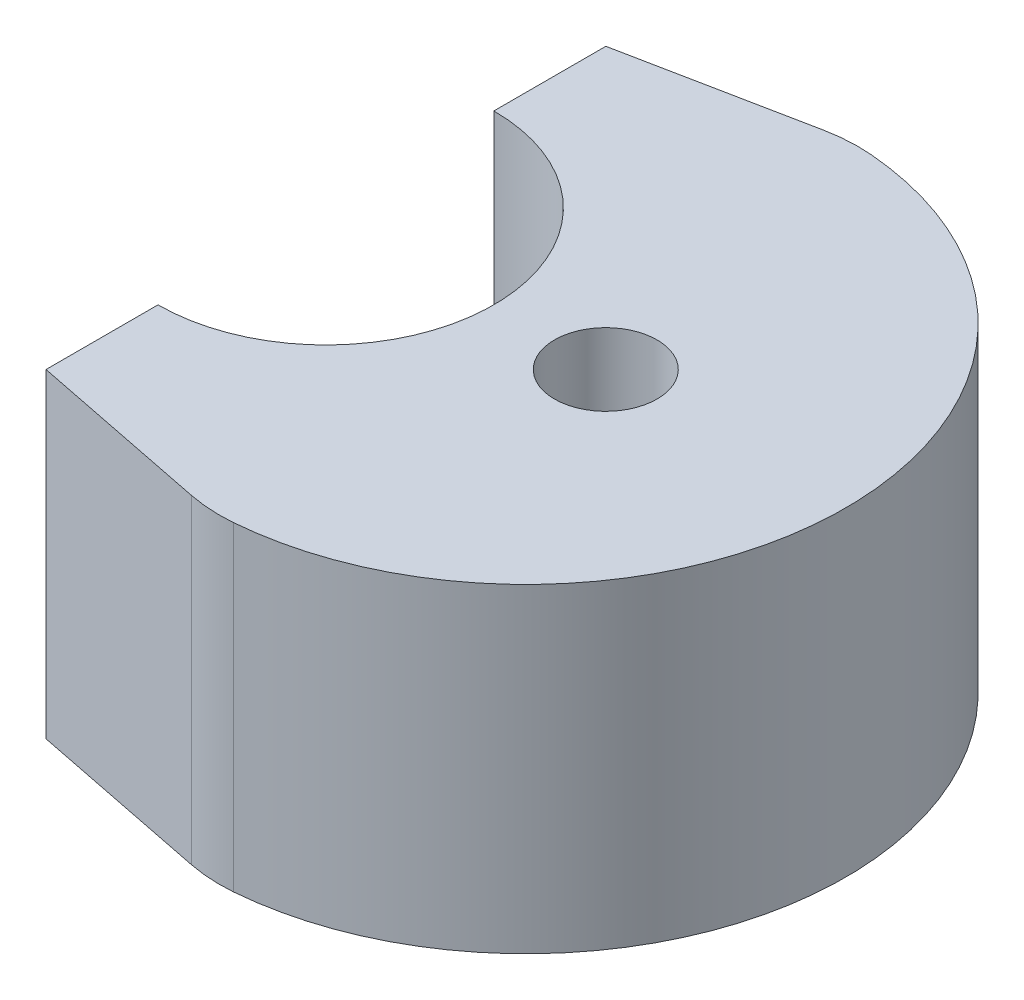
ISO-10303-21;
HEADER;
FILE_DESCRIPTION(('STEP AP214'),'2;1');
FILE_NAME('part.step','',(''),(''),'','','');
FILE_SCHEMA(('AUTOMOTIVE_DESIGN { 1 0 10303 214 1 1 1 1 }'));
ENDSEC;
DATA;
#1=APPLICATION_CONTEXT('core data for automotive mechanical design processes');
#2=APPLICATION_PROTOCOL_DEFINITION('international standard','automotive_design',2000,#1);
#3=PRODUCT_CONTEXT('',#1,'mechanical');
#4=PRODUCT('Part','Part','',(#3));
#5=PRODUCT_RELATED_PRODUCT_CATEGORY('part','',(#4));
#6=PRODUCT_DEFINITION_FORMATION('','',#4);
#7=PRODUCT_DEFINITION_CONTEXT('part definition',#1,'design');
#8=PRODUCT_DEFINITION('design','',#6,#7);
#9=PRODUCT_DEFINITION_SHAPE('','',#8);
#10=(LENGTH_UNIT() NAMED_UNIT(*) SI_UNIT(.MILLI.,.METRE.));
#11=(NAMED_UNIT(*) PLANE_ANGLE_UNIT() SI_UNIT($,.RADIAN.));
#12=(NAMED_UNIT(*) SI_UNIT($,.STERADIAN.) SOLID_ANGLE_UNIT());
#13=UNCERTAINTY_MEASURE_WITH_UNIT(LENGTH_MEASURE(1.E-05),#10,'distance_accuracy_value','');
#14=(GEOMETRIC_REPRESENTATION_CONTEXT(3) GLOBAL_UNCERTAINTY_ASSIGNED_CONTEXT((#13)) GLOBAL_UNIT_ASSIGNED_CONTEXT((#10,
#11,#12)) REPRESENTATION_CONTEXT('',''));
#15=CARTESIAN_POINT('',(0.,0.,0.));
#16=DIRECTION('',(0.,0.,1.));
#17=DIRECTION('',(1.,0.,0.));
#18=AXIS2_PLACEMENT_3D('',#15,#16,#17);
#19=CARTESIAN_POINT('',(0.,0.5,0.));
#20=DIRECTION('',(0.,-1.,0.));
#21=DIRECTION('',(0.,0.,-1.));
#22=AXIS2_PLACEMENT_3D('',#19,#20,#21);
#23=CYLINDRICAL_SURFACE('',#22,2.);
#24=CARTESIAN_POINT('',(0.,0.,0.));
#25=DIRECTION('',(0.,1.,0.));
#26=DIRECTION('',(0.,0.,1.));
#27=AXIS2_PLACEMENT_3D('',#24,#25,#26);
#28=CIRCLE('',#27,2.);
#29=CARTESIAN_POINT('',(0.164100898177524,0.,-1.99325635461607));
#30=VERTEX_POINT('',#29);
#31=CARTESIAN_POINT('',(0.164100898177525,0.,1.99325635461607));
#32=VERTEX_POINT('',#31);
#33=EDGE_CURVE('E103',#30,#32,#28,.F.);
#34=ORIENTED_EDGE('',*,*,#33,.F.);
#35=DIRECTION('',(0.,-1.,0.));
#36=VECTOR('',#35,1.);
#37=CARTESIAN_POINT('',(0.164100898177524,0.5,-1.99325635461607));
#38=LINE('',#37,#36);
#39=CARTESIAN_POINT('',(0.164100898177524,2.,-1.99325635461607));
#40=VERTEX_POINT('',#39);
#41=EDGE_CURVE('E11',#40,#30,#38,.T.);
#42=ORIENTED_EDGE('',*,*,#41,.F.);
#43=CARTESIAN_POINT('',(0.,2.,0.));
#44=DIRECTION('',(0.,1.,0.));
#45=DIRECTION('',(0.,0.,1.));
#46=AXIS2_PLACEMENT_3D('',#43,#44,#45);
#47=CIRCLE('',#46,2.);
#48=CARTESIAN_POINT('',(0.164100898177525,2.,1.99325635461607));
#49=VERTEX_POINT('',#48);
#50=EDGE_CURVE('E174',#40,#49,#47,.F.);
#51=ORIENTED_EDGE('',*,*,#50,.T.);
#52=DIRECTION('',(0.,-1.,0.));
#53=VECTOR('',#52,1.);
#54=CARTESIAN_POINT('',(0.164100898177525,0.5,1.99325635461607));
#55=LINE('',#54,#53);
#56=EDGE_CURVE('E94',#49,#32,#55,.T.);
#57=ORIENTED_EDGE('',*,*,#56,.T.);
#58=EDGE_LOOP('',(#34,#42,#51,#57));
#59=FACE_BOUND('',#58,.T.);
#60=ADVANCED_FACE('F33',(#59),#23,.T.);
#61=CARTESIAN_POINT('',(0.0820504490887622,0.5,-0.996628177308034));
#62=DIRECTION('',(0.,-1.,0.));
#63=DIRECTION('',(0.,0.,-1.));
#64=AXIS2_PLACEMENT_3D('',#61,#62,#63);
#65=CYLINDRICAL_SURFACE('',#64,1.);
#66=CARTESIAN_POINT('',(0.0820504490887622,0.,-0.996628177308034));
#67=DIRECTION('',(0.,1.,0.));
#68=DIRECTION('',(0.,0.,1.));
#69=AXIS2_PLACEMENT_3D('',#66,#67,#68);
#70=CIRCLE('',#69,1.);
#71=CARTESIAN_POINT('',(-0.113883759971435,0.,-1.97724522066388));
#72=VERTEX_POINT('',#71);
#73=EDGE_CURVE('E139',#30,#72,#70,.T.);
#74=ORIENTED_EDGE('',*,*,#73,.T.);
#75=DIRECTION('',(0.,-1.,0.));
#76=VECTOR('',#75,1.);
#77=CARTESIAN_POINT('',(-0.113883759971435,0.5,-1.97724522066388));
#78=LINE('',#77,#76);
#79=CARTESIAN_POINT('',(-0.113883759971435,2.,-1.97724522066388));
#80=VERTEX_POINT('',#79);
#81=EDGE_CURVE('E43',#80,#72,#78,.T.);
#82=ORIENTED_EDGE('',*,*,#81,.F.);
#83=CARTESIAN_POINT('',(0.0820504490887622,2.,-0.996628177308034));
#84=DIRECTION('',(0.,1.,0.));
#85=DIRECTION('',(0.,0.,1.));
#86=AXIS2_PLACEMENT_3D('',#83,#84,#85);
#87=CIRCLE('',#86,1.);
#88=EDGE_CURVE('E184',#40,#80,#87,.T.);
#89=ORIENTED_EDGE('',*,*,#88,.F.);
#90=ORIENTED_EDGE('',*,*,#41,.T.);
#91=EDGE_LOOP('',(#74,#82,#89,#90));
#92=FACE_BOUND('',#91,.T.);
#93=ADVANCED_FACE('F233',(#92),#65,.T.);
#94=CARTESIAN_POINT('',(-0.384272849561752,0.5,-1.92321957143991));
#95=DIRECTION('',(0.195934209060197,0.,0.980617043355843));
#96=DIRECTION('',(0.980617043355843,0.,-0.195934209060197));
#97=AXIS2_PLACEMENT_3D('',#94,#95,#96);
#98=PLANE('',#97);
#99=DIRECTION('',(-0.980617043355843,0.,0.195934209060197));
#100=VECTOR('',#99,1.);
#101=CARTESIAN_POINT('',(-0.384272849561752,0.,-1.92321957143991));
#102=LINE('',#101,#100);
#103=CARTESIAN_POINT('',(-1.24999999999968,0.,-1.7502411741825));
#104=VERTEX_POINT('',#103);
#105=EDGE_CURVE('E142',#72,#104,#102,.T.);
#106=ORIENTED_EDGE('',*,*,#105,.T.);
#107=DIRECTION('',(0.,-1.,0.));
#108=VECTOR('',#107,1.);
#109=CARTESIAN_POINT('',(-1.24999999999968,0.5,-1.7502411741825));
#110=LINE('',#109,#108);
#111=CARTESIAN_POINT('',(-1.24999999999968,2.,-1.7502411741825));
#112=VERTEX_POINT('',#111);
#113=EDGE_CURVE('E118',#112,#104,#110,.T.);
#114=ORIENTED_EDGE('',*,*,#113,.F.);
#115=DIRECTION('',(-0.980617043355843,0.,0.195934209060197));
#116=VECTOR('',#115,1.);
#117=CARTESIAN_POINT('',(-0.384272849561752,2.,-1.92321957143991));
#118=LINE('',#117,#116);
#119=EDGE_CURVE('E191',#80,#112,#118,.T.);
#120=ORIENTED_EDGE('',*,*,#119,.F.);
#121=ORIENTED_EDGE('',*,*,#81,.T.);
#122=EDGE_LOOP('',(#106,#114,#120,#121));
#123=FACE_BOUND('',#122,.T.);
#124=ADVANCED_FACE('F164',(#123),#98,.F.);
#125=CARTESIAN_POINT('',(-1.24999999999968,0.5,0.));
#126=DIRECTION('',(-1.,0.,0.));
#127=DIRECTION('',(0.,0.,1.));
#128=AXIS2_PLACEMENT_3D('',#125,#126,#127);
#129=PLANE('',#128);
#130=DIRECTION('',(0.,0.,-1.));
#131=VECTOR('',#130,1.);
#132=CARTESIAN_POINT('',(-1.24999999999968,0.,0.));
#133=LINE('',#132,#131);
#134=CARTESIAN_POINT('',(-1.24999999999968,0.,-1.2499999999997));
#135=VERTEX_POINT('',#134);
#136=EDGE_CURVE('E145',#135,#104,#133,.T.);
#137=ORIENTED_EDGE('',*,*,#136,.F.);
#138=DIRECTION('',(0.,-1.,0.));
#139=VECTOR('',#138,1.);
#140=CARTESIAN_POINT('',(-1.24999999999968,0.5,-1.2499999999997));
#141=LINE('',#140,#139);
#142=CARTESIAN_POINT('',(-1.24999999999968,0.5,-1.2499999999997));
#143=VERTEX_POINT('',#142);
#144=EDGE_CURVE('E120',#143,#135,#141,.T.);
#145=ORIENTED_EDGE('',*,*,#144,.F.);
#146=DIRECTION('',(0.,0.,1.));
#147=VECTOR('',#146,1.);
#148=CARTESIAN_POINT('',(-1.24999999999968,0.5,0.));
#149=LINE('',#148,#147);
#150=CARTESIAN_POINT('',(-1.24999999999968,0.5,-1.0499999999997));
#151=VERTEX_POINT('',#150);
#152=EDGE_CURVE('E51',#143,#151,#149,.T.);
#153=ORIENTED_EDGE('',*,*,#152,.T.);
#154=DIRECTION('',(0.,-1.,0.));
#155=VECTOR('',#154,1.);
#156=CARTESIAN_POINT('',(-1.24999999999968,2.,-1.0499999999997));
#157=LINE('',#156,#155);
#158=CARTESIAN_POINT('',(-1.24999999999968,2.,-1.0499999999997));
#159=VERTEX_POINT('',#158);
#160=EDGE_CURVE('E197',#159,#151,#157,.T.);
#161=ORIENTED_EDGE('',*,*,#160,.F.);
#162=DIRECTION('',(0.,0.,1.));
#163=VECTOR('',#162,1.);
#164=CARTESIAN_POINT('',(-1.24999999999968,2.,0.));
#165=LINE('',#164,#163);
#166=EDGE_CURVE('E160',#112,#159,#165,.T.);
#167=ORIENTED_EDGE('',*,*,#166,.F.);
#168=ORIENTED_EDGE('',*,*,#113,.T.);
#169=EDGE_LOOP('',(#137,#145,#153,#161,#167,#168));
#170=FACE_BOUND('',#169,.T.);
#171=ADVANCED_FACE('F154',(#170),#129,.T.);
#172=CARTESIAN_POINT('',(-1.24999999999968,0.5,0.));
#173=DIRECTION('',(0.,-1.,0.));
#174=DIRECTION('',(0.,0.,-1.));
#175=AXIS2_PLACEMENT_3D('',#172,#173,#174);
#176=CYLINDRICAL_SURFACE('',#175,1.24999999999969);
#177=CARTESIAN_POINT('',(-1.24999999999968,0.,0.));
#178=DIRECTION('',(0.,1.,0.));
#179=DIRECTION('',(0.,0.,1.));
#180=AXIS2_PLACEMENT_3D('',#177,#178,#179);
#181=CIRCLE('',#180,1.24999999999969);
#182=CARTESIAN_POINT('',(-1.24999999999968,0.,1.24999999999969));
#183=VERTEX_POINT('',#182);
#184=EDGE_CURVE('E111',#183,#135,#181,.T.);
#185=ORIENTED_EDGE('',*,*,#184,.F.);
#186=DIRECTION('',(0.,-1.,0.));
#187=VECTOR('',#186,1.);
#188=CARTESIAN_POINT('',(-1.24999999999968,0.5,1.24999999999969));
#189=LINE('',#188,#187);
#190=CARTESIAN_POINT('',(-1.24999999999968,0.5,1.24999999999969));
#191=VERTEX_POINT('',#190);
#192=EDGE_CURVE('E117',#191,#183,#189,.T.);
#193=ORIENTED_EDGE('',*,*,#192,.F.);
#194=CARTESIAN_POINT('',(-1.24999999999968,0.5,0.));
#195=DIRECTION('',(0.,1.,0.));
#196=DIRECTION('',(0.,0.,1.));
#197=AXIS2_PLACEMENT_3D('',#194,#195,#196);
#198=CIRCLE('',#197,1.24999999999969);
#199=EDGE_CURVE('E104',#191,#143,#198,.T.);
#200=ORIENTED_EDGE('',*,*,#199,.T.);
#201=ORIENTED_EDGE('',*,*,#144,.T.);
#202=EDGE_LOOP('',(#185,#193,#200,#201));
#203=FACE_BOUND('',#202,.T.);
#204=ADVANCED_FACE('F152',(#203),#176,.F.);
#205=CARTESIAN_POINT('',(-1.24999999999968,0.5,0.));
#206=DIRECTION('',(1.,0.,0.));
#207=DIRECTION('',(0.,0.,-1.));
#208=AXIS2_PLACEMENT_3D('',#205,#206,#207);
#209=PLANE('',#208);
#210=DIRECTION('',(0.,0.,1.));
#211=VECTOR('',#210,1.);
#212=CARTESIAN_POINT('',(-1.24999999999968,0.,0.));
#213=LINE('',#212,#211);
#214=CARTESIAN_POINT('',(-1.24999999999968,0.,1.7502411741825));
#215=VERTEX_POINT('',#214);
#216=EDGE_CURVE('E109',#183,#215,#213,.T.);
#217=ORIENTED_EDGE('',*,*,#216,.T.);
#218=DIRECTION('',(0.,-1.,0.));
#219=VECTOR('',#218,1.);
#220=CARTESIAN_POINT('',(-1.24999999999968,0.5,1.7502411741825));
#221=LINE('',#220,#219);
#222=CARTESIAN_POINT('',(-1.24999999999968,2.,1.7502411741825));
#223=VERTEX_POINT('',#222);
#224=EDGE_CURVE('E93',#223,#215,#221,.T.);
#225=ORIENTED_EDGE('',*,*,#224,.F.);
#226=DIRECTION('',(0.,0.,-1.));
#227=VECTOR('',#226,1.);
#228=CARTESIAN_POINT('',(-1.24999999999968,2.,0.));
#229=LINE('',#228,#227);
#230=CARTESIAN_POINT('',(-1.24999999999968,2.,1.04999999999969));
#231=VERTEX_POINT('',#230);
#232=EDGE_CURVE('E186',#223,#231,#229,.T.);
#233=ORIENTED_EDGE('',*,*,#232,.T.);
#234=DIRECTION('',(0.,-1.,0.));
#235=VECTOR('',#234,1.);
#236=CARTESIAN_POINT('',(-1.24999999999968,2.,1.04999999999969));
#237=LINE('',#236,#235);
#238=CARTESIAN_POINT('',(-1.24999999999968,0.5,1.04999999999969));
#239=VERTEX_POINT('',#238);
#240=EDGE_CURVE('E137',#231,#239,#237,.T.);
#241=ORIENTED_EDGE('',*,*,#240,.T.);
#242=DIRECTION('',(0.,0.,-1.));
#243=VECTOR('',#242,1.);
#244=CARTESIAN_POINT('',(-1.24999999999968,0.5,0.));
#245=LINE('',#244,#243);
#246=EDGE_CURVE('E131',#191,#239,#245,.T.);
#247=ORIENTED_EDGE('',*,*,#246,.F.);
#248=ORIENTED_EDGE('',*,*,#192,.T.);
#249=EDGE_LOOP('',(#217,#225,#233,#241,#247,#248));
#250=FACE_BOUND('',#249,.T.);
#251=ADVANCED_FACE('F222',(#250),#209,.F.);
#252=CARTESIAN_POINT('',(-0.384272849561752,0.5,1.92321957143991));
#253=DIRECTION('',(-0.195934209060197,0.,0.980617043355843));
#254=DIRECTION('',(0.980617043355843,0.,0.195934209060197));
#255=AXIS2_PLACEMENT_3D('',#252,#253,#254);
#256=PLANE('',#255);
#257=DIRECTION('',(-0.980617043355843,0.,-0.195934209060197));
#258=VECTOR('',#257,1.);
#259=CARTESIAN_POINT('',(-0.384272849561752,0.,1.92321957143991));
#260=LINE('',#259,#258);
#261=CARTESIAN_POINT('',(-0.113883759971435,0.,1.97724522066388));
#262=VERTEX_POINT('',#261);
#263=EDGE_CURVE('E100',#262,#215,#260,.T.);
#264=ORIENTED_EDGE('',*,*,#263,.F.);
#265=DIRECTION('',(0.,-1.,0.));
#266=VECTOR('',#265,1.);
#267=CARTESIAN_POINT('',(-0.113883759971435,0.5,1.97724522066388));
#268=LINE('',#267,#266);
#269=CARTESIAN_POINT('',(-0.113883759971435,2.,1.97724522066388));
#270=VERTEX_POINT('',#269);
#271=EDGE_CURVE('E80',#270,#262,#268,.T.);
#272=ORIENTED_EDGE('',*,*,#271,.F.);
#273=DIRECTION('',(-0.980617043355843,0.,-0.195934209060197));
#274=VECTOR('',#273,1.);
#275=CARTESIAN_POINT('',(-0.384272849561752,2.,1.92321957143991));
#276=LINE('',#275,#274);
#277=EDGE_CURVE('E182',#270,#223,#276,.T.);
#278=ORIENTED_EDGE('',*,*,#277,.T.);
#279=ORIENTED_EDGE('',*,*,#224,.T.);
#280=EDGE_LOOP('',(#264,#272,#278,#279));
#281=FACE_BOUND('',#280,.T.);
#282=ADVANCED_FACE('F106',(#281),#256,.T.);
#283=CARTESIAN_POINT('',(0.5,0.5,0.));
#284=DIRECTION('',(0.,-1.,0.));
#285=DIRECTION('',(0.,0.,-1.));
#286=AXIS2_PLACEMENT_3D('',#283,#284,#285);
#287=CYLINDRICAL_SURFACE('',#286,0.3207);
#288=CARTESIAN_POINT('',(0.5,0.,0.));
#289=DIRECTION('',(0.,1.,0.));
#290=DIRECTION('',(0.,0.,1.));
#291=AXIS2_PLACEMENT_3D('',#288,#289,#290);
#292=CIRCLE('',#291,0.3207);
#293=CARTESIAN_POINT('',(0.5,0.,0.3207));
#294=VERTEX_POINT('',#293);
#295=EDGE_CURVE('E134',#294,#294,#292,.T.);
#296=ORIENTED_EDGE('',*,*,#295,.F.);
#297=EDGE_LOOP('',(#296));
#298=FACE_BOUND('',#297,.T.);
#299=CARTESIAN_POINT('',(0.5,2.,0.));
#300=DIRECTION('',(0.,1.,0.));
#301=DIRECTION('',(0.,0.,1.));
#302=AXIS2_PLACEMENT_3D('',#299,#300,#301);
#303=CIRCLE('',#302,0.3207);
#304=CARTESIAN_POINT('',(0.5,2.,0.3207));
#305=VERTEX_POINT('',#304);
#306=EDGE_CURVE('E194',#305,#305,#303,.T.);
#307=ORIENTED_EDGE('',*,*,#306,.T.);
#308=EDGE_LOOP('',(#307));
#309=FACE_BOUND('',#308,.T.);
#310=ADVANCED_FACE('F35',(#298,#309),#287,.F.);
#311=CARTESIAN_POINT('',(0.0820504490887623,0.5,0.996628177308034));
#312=DIRECTION('',(0.,-1.,0.));
#313=DIRECTION('',(0.,0.,-1.));
#314=AXIS2_PLACEMENT_3D('',#311,#312,#313);
#315=CYLINDRICAL_SURFACE('',#314,1.);
#316=CARTESIAN_POINT('',(0.0820504490887623,0.,0.996628177308034));
#317=DIRECTION('',(0.,1.,0.));
#318=DIRECTION('',(0.,0.,1.));
#319=AXIS2_PLACEMENT_3D('',#316,#317,#318);
#320=CIRCLE('',#319,1.);
#321=EDGE_CURVE('E84',#262,#32,#320,.T.);
#322=ORIENTED_EDGE('',*,*,#321,.T.);
#323=ORIENTED_EDGE('',*,*,#56,.F.);
#324=CARTESIAN_POINT('',(0.0820504490887623,2.,0.996628177308034));
#325=DIRECTION('',(0.,1.,0.));
#326=DIRECTION('',(0.,0.,1.));
#327=AXIS2_PLACEMENT_3D('',#324,#325,#326);
#328=CIRCLE('',#327,1.);
#329=EDGE_CURVE('E88',#270,#49,#328,.T.);
#330=ORIENTED_EDGE('',*,*,#329,.F.);
#331=ORIENTED_EDGE('',*,*,#271,.T.);
#332=EDGE_LOOP('',(#322,#323,#330,#331));
#333=FACE_BOUND('',#332,.T.);
#334=ADVANCED_FACE('F82',(#333),#315,.T.);
#335=CARTESIAN_POINT('',(0.,0.,0.));
#336=DIRECTION('',(0.,1.,0.));
#337=DIRECTION('',(0.,0.,1.));
#338=AXIS2_PLACEMENT_3D('',#335,#336,#337);
#339=PLANE('',#338);
#340=ORIENTED_EDGE('',*,*,#295,.T.);
#341=EDGE_LOOP('',(#340));
#342=FACE_BOUND('',#341,.T.);
#343=ORIENTED_EDGE('',*,*,#33,.T.);
#344=ORIENTED_EDGE('',*,*,#321,.F.);
#345=ORIENTED_EDGE('',*,*,#263,.T.);
#346=ORIENTED_EDGE('',*,*,#216,.F.);
#347=ORIENTED_EDGE('',*,*,#184,.T.);
#348=ORIENTED_EDGE('',*,*,#136,.T.);
#349=ORIENTED_EDGE('',*,*,#105,.F.);
#350=ORIENTED_EDGE('',*,*,#73,.F.);
#351=EDGE_LOOP('',(#343,#344,#345,#346,#347,#348,#349,#350));
#352=FACE_BOUND('',#351,.T.);
#353=ADVANCED_FACE('F98',(#342,#352),#339,.F.);
#354=CARTESIAN_POINT('',(-1.24999999999968,2.,0.));
#355=DIRECTION('',(0.,-1.,0.));
#356=DIRECTION('',(0.,0.,-1.));
#357=AXIS2_PLACEMENT_3D('',#354,#355,#356);
#358=CYLINDRICAL_SURFACE('',#357,1.04999999999969);
#359=CARTESIAN_POINT('',(-1.24999999999968,0.5,0.));
#360=DIRECTION('',(0.,1.,0.));
#361=DIRECTION('',(0.,0.,1.));
#362=AXIS2_PLACEMENT_3D('',#359,#360,#361);
#363=CIRCLE('',#362,1.04999999999969);
#364=EDGE_CURVE('E198',#239,#151,#363,.T.);
#365=ORIENTED_EDGE('',*,*,#364,.F.);
#366=ORIENTED_EDGE('',*,*,#240,.F.);
#367=CARTESIAN_POINT('',(-1.24999999999968,2.,0.));
#368=DIRECTION('',(0.,1.,0.));
#369=DIRECTION('',(0.,0.,1.));
#370=AXIS2_PLACEMENT_3D('',#367,#368,#369);
#371=CIRCLE('',#370,1.04999999999969);
#372=EDGE_CURVE('E204',#231,#159,#371,.T.);
#373=ORIENTED_EDGE('',*,*,#372,.T.);
#374=ORIENTED_EDGE('',*,*,#160,.T.);
#375=EDGE_LOOP('',(#365,#366,#373,#374));
#376=FACE_BOUND('',#375,.T.);
#377=ADVANCED_FACE('F216',(#376),#358,.F.);
#378=CARTESIAN_POINT('',(0.,2.,0.));
#379=DIRECTION('',(0.,1.,0.));
#380=DIRECTION('',(0.,0.,1.));
#381=AXIS2_PLACEMENT_3D('',#378,#379,#380);
#382=PLANE('',#381);
#383=ORIENTED_EDGE('',*,*,#372,.F.);
#384=ORIENTED_EDGE('',*,*,#232,.F.);
#385=ORIENTED_EDGE('',*,*,#277,.F.);
#386=ORIENTED_EDGE('',*,*,#329,.T.);
#387=ORIENTED_EDGE('',*,*,#50,.F.);
#388=ORIENTED_EDGE('',*,*,#88,.T.);
#389=ORIENTED_EDGE('',*,*,#119,.T.);
#390=ORIENTED_EDGE('',*,*,#166,.T.);
#391=EDGE_LOOP('',(#383,#384,#385,#386,#387,#388,#389,#390));
#392=FACE_BOUND('',#391,.T.);
#393=ORIENTED_EDGE('',*,*,#306,.F.);
#394=EDGE_LOOP('',(#393));
#395=FACE_BOUND('',#394,.T.);
#396=ADVANCED_FACE('F178',(#392,#395),#382,.T.);
#397=CARTESIAN_POINT('',(0.,0.5,0.));
#398=DIRECTION('',(0.,1.,0.));
#399=DIRECTION('',(0.,0.,1.));
#400=AXIS2_PLACEMENT_3D('',#397,#398,#399);
#401=PLANE('',#400);
#402=ORIENTED_EDGE('',*,*,#199,.F.);
#403=ORIENTED_EDGE('',*,*,#246,.T.);
#404=ORIENTED_EDGE('',*,*,#364,.T.);
#405=ORIENTED_EDGE('',*,*,#152,.F.);
#406=EDGE_LOOP('',(#402,#403,#404,#405));
#407=FACE_BOUND('',#406,.T.);
#408=ADVANCED_FACE('F220',(#407),#401,.F.);
#409=CLOSED_SHELL('',(#60,#93,#124,#171,#204,#251,#282,#310,#334,#353,#377,#396,#408));
#410=MANIFOLD_SOLID_BREP('B2',#409);
#411=ADVANCED_BREP_SHAPE_REPRESENTATION('',(#18,#410),#14);
#412=SHAPE_DEFINITION_REPRESENTATION(#9,#411);
ENDSEC;
END-ISO-10303-21;
